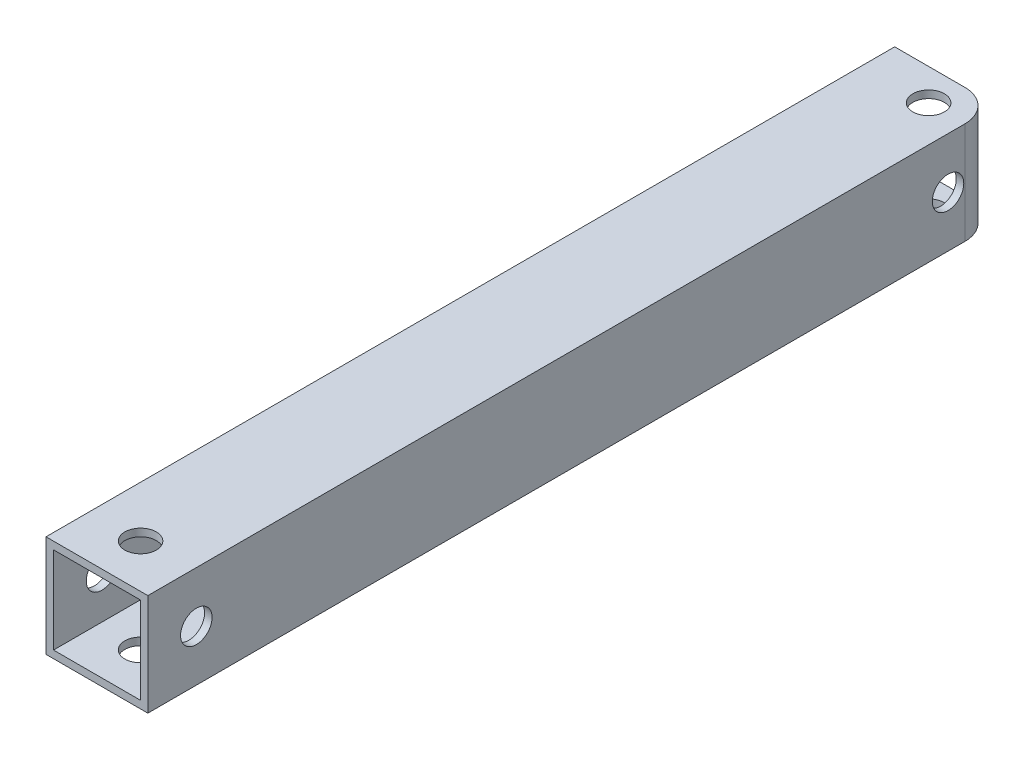
ISO-10303-21;
HEADER;
FILE_DESCRIPTION(('STEP AP214'),'2;1');
FILE_NAME('part.step','',(''),(''),'','','');
FILE_SCHEMA(('AUTOMOTIVE_DESIGN { 1 0 10303 214 1 1 1 1 }'));
ENDSEC;
DATA;
#1=APPLICATION_CONTEXT('core data for automotive mechanical design processes');
#2=APPLICATION_PROTOCOL_DEFINITION('international standard','automotive_design',2000,#1);
#3=PRODUCT_CONTEXT('',#1,'mechanical');
#4=PRODUCT('Part','Part','',(#3));
#5=PRODUCT_RELATED_PRODUCT_CATEGORY('part','',(#4));
#6=PRODUCT_DEFINITION_FORMATION('','',#4);
#7=PRODUCT_DEFINITION_CONTEXT('part definition',#1,'design');
#8=PRODUCT_DEFINITION('design','',#6,#7);
#9=PRODUCT_DEFINITION_SHAPE('','',#8);
#10=(LENGTH_UNIT() NAMED_UNIT(*) SI_UNIT(.MILLI.,.METRE.));
#11=(NAMED_UNIT(*) PLANE_ANGLE_UNIT() SI_UNIT($,.RADIAN.));
#12=(NAMED_UNIT(*) SI_UNIT($,.STERADIAN.) SOLID_ANGLE_UNIT());
#13=UNCERTAINTY_MEASURE_WITH_UNIT(LENGTH_MEASURE(1.E-05),#10,'distance_accuracy_value','');
#14=(GEOMETRIC_REPRESENTATION_CONTEXT(3) GLOBAL_UNCERTAINTY_ASSIGNED_CONTEXT((#13)) GLOBAL_UNIT_ASSIGNED_CONTEXT((#10,
#11,#12)) REPRESENTATION_CONTEXT('',''));
#15=CARTESIAN_POINT('',(0.,0.,0.));
#16=DIRECTION('',(0.,0.,1.));
#17=DIRECTION('',(1.,0.,0.));
#18=AXIS2_PLACEMENT_3D('',#15,#16,#17);
#19=CARTESIAN_POINT('',(0.,0.,175.));
#20=DIRECTION('',(0.,0.,1.));
#21=DIRECTION('',(1.,0.,0.));
#22=AXIS2_PLACEMENT_3D('',#19,#20,#21);
#23=PLANE('',#22);
#24=DIRECTION('',(0.,-1.,0.));
#25=VECTOR('',#24,1.);
#26=CARTESIAN_POINT('',(-21.,-21.,175.));
#27=LINE('',#26,#25);
#28=CARTESIAN_POINT('',(-21.,21.,175.));
#29=VERTEX_POINT('',#28);
#30=CARTESIAN_POINT('',(-21.,-21.,175.));
#31=VERTEX_POINT('',#30);
#32=EDGE_CURVE('E230',#29,#31,#27,.T.);
#33=ORIENTED_EDGE('',*,*,#32,.T.);
#34=DIRECTION('',(1.,0.,0.));
#35=VECTOR('',#34,1.);
#36=CARTESIAN_POINT('',(21.,-21.,175.));
#37=LINE('',#36,#35);
#38=CARTESIAN_POINT('',(21.,-21.,175.));
#39=VERTEX_POINT('',#38);
#40=EDGE_CURVE('E233',#31,#39,#37,.T.);
#41=ORIENTED_EDGE('',*,*,#40,.T.);
#42=DIRECTION('',(0.,1.,0.));
#43=VECTOR('',#42,1.);
#44=CARTESIAN_POINT('',(21.,-21.,175.));
#45=LINE('',#44,#43);
#46=CARTESIAN_POINT('',(21.,21.,175.));
#47=VERTEX_POINT('',#46);
#48=EDGE_CURVE('E198',#39,#47,#45,.T.);
#49=ORIENTED_EDGE('',*,*,#48,.T.);
#50=DIRECTION('',(-1.,0.,0.));
#51=VECTOR('',#50,1.);
#52=CARTESIAN_POINT('',(21.,21.,175.));
#53=LINE('',#52,#51);
#54=EDGE_CURVE('E237',#47,#29,#53,.T.);
#55=ORIENTED_EDGE('',*,*,#54,.T.);
#56=EDGE_LOOP('',(#33,#41,#49,#55));
#57=FACE_BOUND('',#56,.T.);
#58=DIRECTION('',(0.,-1.,0.));
#59=VECTOR('',#58,1.);
#60=CARTESIAN_POINT('',(-17.9,17.9,175.));
#61=LINE('',#60,#59);
#62=CARTESIAN_POINT('',(-17.9,17.9,175.));
#63=VERTEX_POINT('',#62);
#64=CARTESIAN_POINT('',(-17.9,-17.9,175.));
#65=VERTEX_POINT('',#64);
#66=EDGE_CURVE('E139',#63,#65,#61,.T.);
#67=ORIENTED_EDGE('',*,*,#66,.F.);
#68=DIRECTION('',(-1.,0.,0.));
#69=VECTOR('',#68,1.);
#70=CARTESIAN_POINT('',(17.9,17.9,175.));
#71=LINE('',#70,#69);
#72=CARTESIAN_POINT('',(17.9,17.9,175.));
#73=VERTEX_POINT('',#72);
#74=EDGE_CURVE('E288',#73,#63,#71,.T.);
#75=ORIENTED_EDGE('',*,*,#74,.F.);
#76=DIRECTION('',(0.,1.,0.));
#77=VECTOR('',#76,1.);
#78=CARTESIAN_POINT('',(17.9,-17.9,175.));
#79=LINE('',#78,#77);
#80=CARTESIAN_POINT('',(17.9,-17.9,175.));
#81=VERTEX_POINT('',#80);
#82=EDGE_CURVE('E149',#81,#73,#79,.T.);
#83=ORIENTED_EDGE('',*,*,#82,.F.);
#84=DIRECTION('',(1.,0.,0.));
#85=VECTOR('',#84,1.);
#86=CARTESIAN_POINT('',(-17.9,-17.9,175.));
#87=LINE('',#86,#85);
#88=EDGE_CURVE('E129',#65,#81,#87,.T.);
#89=ORIENTED_EDGE('',*,*,#88,.F.);
#90=EDGE_LOOP('',(#67,#75,#83,#89));
#91=FACE_BOUND('',#90,.T.);
#92=ADVANCED_FACE('F47',(#57,#91),#23,.T.);
#93=CARTESIAN_POINT('',(0.,0.,-175.));
#94=DIRECTION('',(0.,0.,1.));
#95=DIRECTION('',(1.,0.,0.));
#96=AXIS2_PLACEMENT_3D('',#93,#94,#95);
#97=PLANE('',#96);
#98=DIRECTION('',(-1.,0.,0.));
#99=VECTOR('',#98,1.);
#100=CARTESIAN_POINT('',(21.,21.,-175.));
#101=LINE('',#100,#99);
#102=CARTESIAN_POINT('',(8.,21.,-175.));
#103=VERTEX_POINT('',#102);
#104=CARTESIAN_POINT('',(-21.,21.,-175.));
#105=VERTEX_POINT('',#104);
#106=EDGE_CURVE('E224',#103,#105,#101,.T.);
#107=ORIENTED_EDGE('',*,*,#106,.F.);
#108=DIRECTION('',(0.,1.,0.));
#109=VECTOR('',#108,1.);
#110=CARTESIAN_POINT('',(8.,0.,-175.));
#111=LINE('',#110,#109);
#112=CARTESIAN_POINT('',(7.99999999999999,17.9,-175.));
#113=VERTEX_POINT('',#112);
#114=EDGE_CURVE('E169',#103,#113,#111,.F.);
#115=ORIENTED_EDGE('',*,*,#114,.T.);
#116=DIRECTION('',(-1.,0.,0.));
#117=VECTOR('',#116,1.);
#118=CARTESIAN_POINT('',(17.9,17.9,-175.));
#119=LINE('',#118,#117);
#120=CARTESIAN_POINT('',(-17.9,17.9,-175.));
#121=VERTEX_POINT('',#120);
#122=EDGE_CURVE('E160',#113,#121,#119,.T.);
#123=ORIENTED_EDGE('',*,*,#122,.T.);
#124=DIRECTION('',(0.,-1.,0.));
#125=VECTOR('',#124,1.);
#126=CARTESIAN_POINT('',(-17.9,17.9,-175.));
#127=LINE('',#126,#125);
#128=CARTESIAN_POINT('',(-17.9,-17.9,-175.));
#129=VERTEX_POINT('',#128);
#130=EDGE_CURVE('E146',#121,#129,#127,.T.);
#131=ORIENTED_EDGE('',*,*,#130,.T.);
#132=DIRECTION('',(1.,0.,0.));
#133=VECTOR('',#132,1.);
#134=CARTESIAN_POINT('',(-17.9,-17.9,-175.));
#135=LINE('',#134,#133);
#136=CARTESIAN_POINT('',(8.,-17.9,-175.));
#137=VERTEX_POINT('',#136);
#138=EDGE_CURVE('E132',#129,#137,#135,.T.);
#139=ORIENTED_EDGE('',*,*,#138,.T.);
#140=DIRECTION('',(0.,1.,0.));
#141=VECTOR('',#140,1.);
#142=CARTESIAN_POINT('',(8.,0.,-175.));
#143=LINE('',#142,#141);
#144=CARTESIAN_POINT('',(8.00000000000001,-21.,-175.));
#145=VERTEX_POINT('',#144);
#146=EDGE_CURVE('E167',#137,#145,#143,.F.);
#147=ORIENTED_EDGE('',*,*,#146,.T.);
#148=DIRECTION('',(1.,0.,0.));
#149=VECTOR('',#148,1.);
#150=CARTESIAN_POINT('',(21.,-21.,-175.));
#151=LINE('',#150,#149);
#152=CARTESIAN_POINT('',(-21.,-21.,-175.));
#153=VERTEX_POINT('',#152);
#154=EDGE_CURVE('E193',#153,#145,#151,.T.);
#155=ORIENTED_EDGE('',*,*,#154,.F.);
#156=DIRECTION('',(0.,-1.,0.));
#157=VECTOR('',#156,1.);
#158=CARTESIAN_POINT('',(-21.,-21.,-175.));
#159=LINE('',#158,#157);
#160=EDGE_CURVE('E145',#105,#153,#159,.T.);
#161=ORIENTED_EDGE('',*,*,#160,.F.);
#162=EDGE_LOOP('',(#107,#115,#123,#131,#139,#147,#155,#161));
#163=FACE_BOUND('',#162,.T.);
#164=ADVANCED_FACE('F179',(#163),#97,.F.);
#165=CARTESIAN_POINT('',(-21.,-21.,175.));
#166=DIRECTION('',(1.,0.,0.));
#167=DIRECTION('',(0.,1.,0.));
#168=AXIS2_PLACEMENT_3D('',#165,#166,#167);
#169=PLANE('',#168);
#170=CARTESIAN_POINT('',(-21.,0.,155.));
#171=DIRECTION('',(-1.,0.,0.));
#172=DIRECTION('',(0.,-1.,0.));
#173=AXIS2_PLACEMENT_3D('',#170,#171,#172);
#174=CIRCLE('',#173,6.50000000000002);
#175=CARTESIAN_POINT('',(-21.,-6.50000000000002,155.));
#176=VERTEX_POINT('',#175);
#177=EDGE_CURVE('E271',#176,#176,#174,.T.);
#178=ORIENTED_EDGE('',*,*,#177,.F.);
#179=EDGE_LOOP('',(#178));
#180=FACE_BOUND('',#179,.T.);
#181=CARTESIAN_POINT('',(-21.,0.,-155.));
#182=DIRECTION('',(1.,0.,0.));
#183=DIRECTION('',(0.,1.,0.));
#184=AXIS2_PLACEMENT_3D('',#181,#182,#183);
#185=CIRCLE('',#184,6.50000000000002);
#186=CARTESIAN_POINT('',(-21.,6.50000000000001,-155.));
#187=VERTEX_POINT('',#186);
#188=EDGE_CURVE('E274',#187,#187,#185,.T.);
#189=ORIENTED_EDGE('',*,*,#188,.T.);
#190=EDGE_LOOP('',(#189));
#191=FACE_BOUND('',#190,.T.);
#192=ORIENTED_EDGE('',*,*,#160,.T.);
#193=DIRECTION('',(0.,0.,-1.));
#194=VECTOR('',#193,1.);
#195=CARTESIAN_POINT('',(-21.,-21.,175.));
#196=LINE('',#195,#194);
#197=EDGE_CURVE('E199',#31,#153,#196,.T.);
#198=ORIENTED_EDGE('',*,*,#197,.F.);
#199=ORIENTED_EDGE('',*,*,#32,.F.);
#200=DIRECTION('',(0.,0.,-1.));
#201=VECTOR('',#200,1.);
#202=CARTESIAN_POINT('',(-21.,21.,175.));
#203=LINE('',#202,#201);
#204=EDGE_CURVE('E203',#29,#105,#203,.T.);
#205=ORIENTED_EDGE('',*,*,#204,.T.);
#206=EDGE_LOOP('',(#192,#198,#199,#205));
#207=FACE_BOUND('',#206,.T.);
#208=ADVANCED_FACE('F245',(#180,#191,#207),#169,.F.);
#209=CARTESIAN_POINT('',(21.,-21.,175.));
#210=DIRECTION('',(0.,1.,0.));
#211=DIRECTION('',(-1.,0.,0.));
#212=AXIS2_PLACEMENT_3D('',#209,#210,#211);
#213=PLANE('',#212);
#214=CARTESIAN_POINT('',(6.,-21.,-162.));
#215=DIRECTION('',(0.,1.,0.));
#216=DIRECTION('',(-1.,0.,0.));
#217=AXIS2_PLACEMENT_3D('',#214,#215,#216);
#218=CIRCLE('',#217,6.50000000000001);
#219=CARTESIAN_POINT('',(-0.500000000000006,-21.,-162.));
#220=VERTEX_POINT('',#219);
#221=EDGE_CURVE('E220',#220,#220,#218,.T.);
#222=ORIENTED_EDGE('',*,*,#221,.T.);
#223=EDGE_LOOP('',(#222));
#224=FACE_BOUND('',#223,.T.);
#225=CARTESIAN_POINT('',(0.,-21.,157.));
#226=DIRECTION('',(0.,-1.,0.));
#227=DIRECTION('',(1.,0.,0.));
#228=AXIS2_PLACEMENT_3D('',#225,#226,#227);
#229=CIRCLE('',#228,6.50000000000001);
#230=CARTESIAN_POINT('',(6.50000000000001,-21.,157.));
#231=VERTEX_POINT('',#230);
#232=EDGE_CURVE('E211',#231,#231,#229,.T.);
#233=ORIENTED_EDGE('',*,*,#232,.F.);
#234=EDGE_LOOP('',(#233));
#235=FACE_BOUND('',#234,.T.);
#236=ORIENTED_EDGE('',*,*,#154,.T.);
#237=CARTESIAN_POINT('',(8.,-21.,-162.));
#238=DIRECTION('',(0.,1.,0.));
#239=DIRECTION('',(-1.,0.,0.));
#240=AXIS2_PLACEMENT_3D('',#237,#238,#239);
#241=CIRCLE('',#240,13.);
#242=CARTESIAN_POINT('',(21.,-21.,-162.));
#243=VERTEX_POINT('',#242);
#244=EDGE_CURVE('E14',#145,#243,#241,.F.);
#245=ORIENTED_EDGE('',*,*,#244,.T.);
#246=DIRECTION('',(0.,0.,-1.));
#247=VECTOR('',#246,1.);
#248=CARTESIAN_POINT('',(21.,-21.,175.));
#249=LINE('',#248,#247);
#250=EDGE_CURVE('E190',#39,#243,#249,.T.);
#251=ORIENTED_EDGE('',*,*,#250,.F.);
#252=ORIENTED_EDGE('',*,*,#40,.F.);
#253=ORIENTED_EDGE('',*,*,#197,.T.);
#254=EDGE_LOOP('',(#236,#245,#251,#252,#253));
#255=FACE_BOUND('',#254,.T.);
#256=ADVANCED_FACE('F189',(#224,#235,#255),#213,.F.);
#257=CARTESIAN_POINT('',(21.,-21.,175.));
#258=DIRECTION('',(-1.,0.,0.));
#259=DIRECTION('',(0.,-1.,0.));
#260=AXIS2_PLACEMENT_3D('',#257,#258,#259);
#261=PLANE('',#260);
#262=CARTESIAN_POINT('',(21.,0.,155.));
#263=DIRECTION('',(-1.,0.,0.));
#264=DIRECTION('',(0.,-1.,0.));
#265=AXIS2_PLACEMENT_3D('',#262,#263,#264);
#266=CIRCLE('',#265,6.50000000000002);
#267=CARTESIAN_POINT('',(21.,-6.50000000000001,155.));
#268=VERTEX_POINT('',#267);
#269=EDGE_CURVE('E353',#268,#268,#266,.T.);
#270=ORIENTED_EDGE('',*,*,#269,.T.);
#271=EDGE_LOOP('',(#270));
#272=FACE_BOUND('',#271,.T.);
#273=CARTESIAN_POINT('',(21.,0.,-155.));
#274=DIRECTION('',(1.,0.,0.));
#275=DIRECTION('',(0.,1.,0.));
#276=AXIS2_PLACEMENT_3D('',#273,#274,#275);
#277=CIRCLE('',#276,6.50000000000002);
#278=CARTESIAN_POINT('',(21.,6.50000000000002,-155.));
#279=VERTEX_POINT('',#278);
#280=EDGE_CURVE('E216',#279,#279,#277,.T.);
#281=ORIENTED_EDGE('',*,*,#280,.F.);
#282=EDGE_LOOP('',(#281));
#283=FACE_BOUND('',#282,.T.);
#284=ORIENTED_EDGE('',*,*,#250,.T.);
#285=DIRECTION('',(0.,1.,0.));
#286=VECTOR('',#285,1.);
#287=CARTESIAN_POINT('',(21.,-21.,-162.));
#288=LINE('',#287,#286);
#289=CARTESIAN_POINT('',(21.,21.,-162.));
#290=VERTEX_POINT('',#289);
#291=EDGE_CURVE('E185',#243,#290,#288,.T.);
#292=ORIENTED_EDGE('',*,*,#291,.T.);
#293=DIRECTION('',(0.,0.,-1.));
#294=VECTOR('',#293,1.);
#295=CARTESIAN_POINT('',(21.,21.,175.));
#296=LINE('',#295,#294);
#297=EDGE_CURVE('E200',#47,#290,#296,.T.);
#298=ORIENTED_EDGE('',*,*,#297,.F.);
#299=ORIENTED_EDGE('',*,*,#48,.F.);
#300=EDGE_LOOP('',(#284,#292,#298,#299));
#301=FACE_BOUND('',#300,.T.);
#302=ADVANCED_FACE('F195',(#272,#283,#301),#261,.F.);
#303=CARTESIAN_POINT('',(21.,21.,175.));
#304=DIRECTION('',(0.,-1.,0.));
#305=DIRECTION('',(1.,0.,0.));
#306=AXIS2_PLACEMENT_3D('',#303,#304,#305);
#307=PLANE('',#306);
#308=CARTESIAN_POINT('',(6.,21.,-162.));
#309=DIRECTION('',(0.,1.,0.));
#310=DIRECTION('',(-1.,0.,0.));
#311=AXIS2_PLACEMENT_3D('',#308,#309,#310);
#312=CIRCLE('',#311,6.50000000000001);
#313=CARTESIAN_POINT('',(-0.500000000000009,21.,-162.));
#314=VERTEX_POINT('',#313);
#315=EDGE_CURVE('E356',#314,#314,#312,.T.);
#316=ORIENTED_EDGE('',*,*,#315,.F.);
#317=EDGE_LOOP('',(#316));
#318=FACE_BOUND('',#317,.T.);
#319=CARTESIAN_POINT('',(0.,21.,157.));
#320=DIRECTION('',(0.,-1.,0.));
#321=DIRECTION('',(1.,0.,0.));
#322=AXIS2_PLACEMENT_3D('',#319,#320,#321);
#323=CIRCLE('',#322,6.50000000000001);
#324=CARTESIAN_POINT('',(6.50000000000001,21.,157.));
#325=VERTEX_POINT('',#324);
#326=EDGE_CURVE('E164',#325,#325,#323,.T.);
#327=ORIENTED_EDGE('',*,*,#326,.T.);
#328=EDGE_LOOP('',(#327));
#329=FACE_BOUND('',#328,.T.);
#330=ORIENTED_EDGE('',*,*,#297,.T.);
#331=CARTESIAN_POINT('',(7.99999999999999,21.,-162.));
#332=DIRECTION('',(0.,-1.,0.));
#333=DIRECTION('',(1.,0.,0.));
#334=AXIS2_PLACEMENT_3D('',#331,#332,#333);
#335=CIRCLE('',#334,13.);
#336=EDGE_CURVE('E165',#290,#103,#335,.F.);
#337=ORIENTED_EDGE('',*,*,#336,.T.);
#338=ORIENTED_EDGE('',*,*,#106,.T.);
#339=ORIENTED_EDGE('',*,*,#204,.F.);
#340=ORIENTED_EDGE('',*,*,#54,.F.);
#341=EDGE_LOOP('',(#330,#337,#338,#339,#340));
#342=FACE_BOUND('',#341,.T.);
#343=ADVANCED_FACE('F222',(#318,#329,#342),#307,.F.);
#344=CARTESIAN_POINT('',(17.9,17.9,175.));
#345=DIRECTION('',(0.,-1.,0.));
#346=DIRECTION('',(1.,0.,0.));
#347=AXIS2_PLACEMENT_3D('',#344,#345,#346);
#348=PLANE('',#347);
#349=CARTESIAN_POINT('',(6.,17.9,-162.));
#350=DIRECTION('',(0.,-1.,0.));
#351=DIRECTION('',(1.,0.,0.));
#352=AXIS2_PLACEMENT_3D('',#349,#350,#351);
#353=CIRCLE('',#352,6.50000000000001);
#354=CARTESIAN_POINT('',(12.5,17.9,-162.));
#355=VERTEX_POINT('',#354);
#356=EDGE_CURVE('E219',#355,#355,#353,.T.);
#357=ORIENTED_EDGE('',*,*,#356,.F.);
#358=EDGE_LOOP('',(#357));
#359=FACE_BOUND('',#358,.T.);
#360=CARTESIAN_POINT('',(0.,17.9,157.));
#361=DIRECTION('',(0.,-1.,0.));
#362=DIRECTION('',(1.,0.,0.));
#363=AXIS2_PLACEMENT_3D('',#360,#361,#362);
#364=CIRCLE('',#363,6.50000000000001);
#365=CARTESIAN_POINT('',(6.50000000000001,17.9,157.));
#366=VERTEX_POINT('',#365);
#367=EDGE_CURVE('E210',#366,#366,#364,.T.);
#368=ORIENTED_EDGE('',*,*,#367,.F.);
#369=EDGE_LOOP('',(#368));
#370=FACE_BOUND('',#369,.T.);
#371=ORIENTED_EDGE('',*,*,#122,.F.);
#372=CARTESIAN_POINT('',(7.99999999999999,17.9,-162.));
#373=DIRECTION('',(0.,-1.,0.));
#374=DIRECTION('',(1.,0.,0.));
#375=AXIS2_PLACEMENT_3D('',#372,#373,#374);
#376=CIRCLE('',#375,13.);
#377=CARTESIAN_POINT('',(17.9,17.9,-170.425556361452));
#378=VERTEX_POINT('',#377);
#379=EDGE_CURVE('E71',#113,#378,#376,.T.);
#380=ORIENTED_EDGE('',*,*,#379,.T.);
#381=DIRECTION('',(0.,0.,-1.));
#382=VECTOR('',#381,1.);
#383=CARTESIAN_POINT('',(17.9,17.9,175.));
#384=LINE('',#383,#382);
#385=EDGE_CURVE('E163',#73,#378,#384,.T.);
#386=ORIENTED_EDGE('',*,*,#385,.F.);
#387=ORIENTED_EDGE('',*,*,#74,.T.);
#388=DIRECTION('',(0.,0.,-1.));
#389=VECTOR('',#388,1.);
#390=CARTESIAN_POINT('',(-17.9,17.9,175.));
#391=LINE('',#390,#389);
#392=EDGE_CURVE('E142',#63,#121,#391,.T.);
#393=ORIENTED_EDGE('',*,*,#392,.T.);
#394=EDGE_LOOP('',(#371,#380,#386,#387,#393));
#395=FACE_BOUND('',#394,.T.);
#396=ADVANCED_FACE('F257',(#359,#370,#395),#348,.T.);
#397=CARTESIAN_POINT('',(17.9,-17.9,175.));
#398=DIRECTION('',(-1.,0.,0.));
#399=DIRECTION('',(0.,-1.,0.));
#400=AXIS2_PLACEMENT_3D('',#397,#398,#399);
#401=PLANE('',#400);
#402=CARTESIAN_POINT('',(17.9,0.,155.));
#403=DIRECTION('',(-1.,0.,0.));
#404=DIRECTION('',(0.,-1.,0.));
#405=AXIS2_PLACEMENT_3D('',#402,#403,#404);
#406=CIRCLE('',#405,6.50000000000002);
#407=CARTESIAN_POINT('',(17.9,-6.50000000000001,155.));
#408=VERTEX_POINT('',#407);
#409=EDGE_CURVE('E349',#408,#408,#406,.T.);
#410=ORIENTED_EDGE('',*,*,#409,.F.);
#411=EDGE_LOOP('',(#410));
#412=FACE_BOUND('',#411,.T.);
#413=CARTESIAN_POINT('',(17.9,0.,-155.));
#414=DIRECTION('',(-1.,0.,0.));
#415=DIRECTION('',(0.,-1.,0.));
#416=AXIS2_PLACEMENT_3D('',#413,#414,#415);
#417=CIRCLE('',#416,6.50000000000002);
#418=CARTESIAN_POINT('',(17.9,-6.50000000000002,-155.));
#419=VERTEX_POINT('',#418);
#420=EDGE_CURVE('E215',#419,#419,#417,.T.);
#421=ORIENTED_EDGE('',*,*,#420,.F.);
#422=EDGE_LOOP('',(#421));
#423=FACE_BOUND('',#422,.T.);
#424=ORIENTED_EDGE('',*,*,#385,.T.);
#425=DIRECTION('',(0.,1.,0.));
#426=VECTOR('',#425,1.);
#427=CARTESIAN_POINT('',(17.9,17.9,-170.425556361452));
#428=LINE('',#427,#426);
#429=CARTESIAN_POINT('',(17.9,-17.9,-170.425556361452));
#430=VERTEX_POINT('',#429);
#431=EDGE_CURVE('E63',#378,#430,#428,.F.);
#432=ORIENTED_EDGE('',*,*,#431,.T.);
#433=DIRECTION('',(0.,0.,-1.));
#434=VECTOR('',#433,1.);
#435=CARTESIAN_POINT('',(17.9,-17.9,175.));
#436=LINE('',#435,#434);
#437=EDGE_CURVE('E174',#81,#430,#436,.T.);
#438=ORIENTED_EDGE('',*,*,#437,.F.);
#439=ORIENTED_EDGE('',*,*,#82,.T.);
#440=EDGE_LOOP('',(#424,#432,#438,#439));
#441=FACE_BOUND('',#440,.T.);
#442=ADVANCED_FACE('F307',(#412,#423,#441),#401,.T.);
#443=CARTESIAN_POINT('',(-17.9,-17.9,175.));
#444=DIRECTION('',(0.,1.,0.));
#445=DIRECTION('',(-1.,0.,0.));
#446=AXIS2_PLACEMENT_3D('',#443,#444,#445);
#447=PLANE('',#446);
#448=CARTESIAN_POINT('',(6.,-17.9,-162.));
#449=DIRECTION('',(0.,1.,0.));
#450=DIRECTION('',(-1.,0.,0.));
#451=AXIS2_PLACEMENT_3D('',#448,#449,#450);
#452=CIRCLE('',#451,6.50000000000001);
#453=CARTESIAN_POINT('',(-0.500000000000006,-17.9,-162.));
#454=VERTEX_POINT('',#453);
#455=EDGE_CURVE('E217',#454,#454,#452,.T.);
#456=ORIENTED_EDGE('',*,*,#455,.F.);
#457=EDGE_LOOP('',(#456));
#458=FACE_BOUND('',#457,.T.);
#459=CARTESIAN_POINT('',(0.,-17.9,157.));
#460=DIRECTION('',(0.,1.,0.));
#461=DIRECTION('',(-1.,0.,0.));
#462=AXIS2_PLACEMENT_3D('',#459,#460,#461);
#463=CIRCLE('',#462,6.50000000000001);
#464=CARTESIAN_POINT('',(6.50000000000001,-17.9,157.));
#465=VERTEX_POINT('',#464);
#466=EDGE_CURVE('E207',#465,#465,#463,.T.);
#467=ORIENTED_EDGE('',*,*,#466,.F.);
#468=EDGE_LOOP('',(#467));
#469=FACE_BOUND('',#468,.T.);
#470=ORIENTED_EDGE('',*,*,#437,.T.);
#471=CARTESIAN_POINT('',(8.,-17.9,-162.));
#472=DIRECTION('',(0.,1.,0.));
#473=DIRECTION('',(-1.,0.,0.));
#474=AXIS2_PLACEMENT_3D('',#471,#472,#473);
#475=CIRCLE('',#474,13.);
#476=EDGE_CURVE('E56',#430,#137,#475,.T.);
#477=ORIENTED_EDGE('',*,*,#476,.T.);
#478=ORIENTED_EDGE('',*,*,#138,.F.);
#479=DIRECTION('',(0.,0.,-1.));
#480=VECTOR('',#479,1.);
#481=CARTESIAN_POINT('',(-17.9,-17.9,175.));
#482=LINE('',#481,#480);
#483=EDGE_CURVE('E125',#65,#129,#482,.T.);
#484=ORIENTED_EDGE('',*,*,#483,.F.);
#485=ORIENTED_EDGE('',*,*,#88,.T.);
#486=EDGE_LOOP('',(#470,#477,#478,#484,#485));
#487=FACE_BOUND('',#486,.T.);
#488=ADVANCED_FACE('F127',(#458,#469,#487),#447,.T.);
#489=CARTESIAN_POINT('',(-17.9,17.9,175.));
#490=DIRECTION('',(1.,0.,0.));
#491=DIRECTION('',(0.,1.,0.));
#492=AXIS2_PLACEMENT_3D('',#489,#490,#491);
#493=PLANE('',#492);
#494=CARTESIAN_POINT('',(-17.9,0.,155.));
#495=DIRECTION('',(1.,0.,0.));
#496=DIRECTION('',(0.,1.,0.));
#497=AXIS2_PLACEMENT_3D('',#494,#495,#496);
#498=CIRCLE('',#497,6.50000000000002);
#499=CARTESIAN_POINT('',(-17.9,-6.50000000000002,155.));
#500=VERTEX_POINT('',#499);
#501=EDGE_CURVE('E51',#500,#500,#498,.T.);
#502=ORIENTED_EDGE('',*,*,#501,.F.);
#503=EDGE_LOOP('',(#502));
#504=FACE_BOUND('',#503,.T.);
#505=CARTESIAN_POINT('',(-17.9,0.,-155.));
#506=DIRECTION('',(1.,0.,0.));
#507=DIRECTION('',(0.,1.,0.));
#508=AXIS2_PLACEMENT_3D('',#505,#506,#507);
#509=CIRCLE('',#508,6.50000000000002);
#510=CARTESIAN_POINT('',(-17.9,6.50000000000001,-155.));
#511=VERTEX_POINT('',#510);
#512=EDGE_CURVE('E212',#511,#511,#509,.T.);
#513=ORIENTED_EDGE('',*,*,#512,.F.);
#514=EDGE_LOOP('',(#513));
#515=FACE_BOUND('',#514,.T.);
#516=ORIENTED_EDGE('',*,*,#130,.F.);
#517=ORIENTED_EDGE('',*,*,#392,.F.);
#518=ORIENTED_EDGE('',*,*,#66,.T.);
#519=ORIENTED_EDGE('',*,*,#483,.T.);
#520=EDGE_LOOP('',(#516,#517,#518,#519));
#521=FACE_BOUND('',#520,.T.);
#522=ADVANCED_FACE('F140',(#504,#515,#521),#493,.T.);
#523=CARTESIAN_POINT('',(0.,39.,157.));
#524=DIRECTION('',(0.,-1.,0.));
#525=DIRECTION('',(1.,0.,0.));
#526=AXIS2_PLACEMENT_3D('',#523,#524,#525);
#527=CYLINDRICAL_SURFACE('',#526,6.50000000000001);
#528=CARTESIAN_POINT('',(6.50000000000001,-17.9,157.));
#529=CARTESIAN_POINT('',(6.50000000000001,-17.9322916666667,157.));
#530=CARTESIAN_POINT('',(6.50000000000001,-17.9645833333333,157.));
#531=CARTESIAN_POINT('',(6.50000000000001,-18.0291666666667,157.));
#532=CARTESIAN_POINT('',(6.50000000000001,-18.0614583333333,157.));
#533=CARTESIAN_POINT('',(6.50000000000001,-18.1260416666667,157.));
#534=CARTESIAN_POINT('',(6.50000000000001,-18.1583333333333,157.));
#535=CARTESIAN_POINT('',(6.50000000000001,-18.2229166666667,157.));
#536=CARTESIAN_POINT('',(6.50000000000001,-18.2552083333333,157.));
#537=CARTESIAN_POINT('',(6.50000000000001,-18.3197916666667,157.));
#538=CARTESIAN_POINT('',(6.50000000000001,-18.3520833333333,157.));
#539=CARTESIAN_POINT('',(6.50000000000001,-18.4166666666667,157.));
#540=CARTESIAN_POINT('',(6.50000000000001,-18.4489583333333,157.));
#541=CARTESIAN_POINT('',(6.50000000000001,-18.5135416666667,157.));
#542=CARTESIAN_POINT('',(6.50000000000001,-18.5458333333333,157.));
#543=CARTESIAN_POINT('',(6.50000000000001,-18.6104166666667,157.));
#544=CARTESIAN_POINT('',(6.50000000000001,-18.6427083333333,157.));
#545=CARTESIAN_POINT('',(6.50000000000001,-18.7072916666667,157.));
#546=CARTESIAN_POINT('',(6.50000000000001,-18.7395833333333,157.));
#547=CARTESIAN_POINT('',(6.50000000000001,-18.8041666666667,157.));
#548=CARTESIAN_POINT('',(6.50000000000001,-18.8364583333333,157.));
#549=CARTESIAN_POINT('',(6.50000000000001,-18.9010416666667,157.));
#550=CARTESIAN_POINT('',(6.50000000000001,-18.9333333333333,157.));
#551=CARTESIAN_POINT('',(6.50000000000001,-18.9979166666667,157.));
#552=CARTESIAN_POINT('',(6.50000000000001,-19.0302083333333,157.));
#553=CARTESIAN_POINT('',(6.50000000000001,-19.0947916666667,157.));
#554=CARTESIAN_POINT('',(6.50000000000001,-19.1270833333333,157.));
#555=CARTESIAN_POINT('',(6.50000000000001,-19.1916666666667,157.));
#556=CARTESIAN_POINT('',(6.50000000000001,-19.2239583333333,157.));
#557=CARTESIAN_POINT('',(6.50000000000001,-19.2885416666667,157.));
#558=CARTESIAN_POINT('',(6.50000000000001,-19.3208333333333,157.));
#559=CARTESIAN_POINT('',(6.50000000000001,-19.3854166666667,157.));
#560=CARTESIAN_POINT('',(6.50000000000001,-19.4177083333333,157.));
#561=CARTESIAN_POINT('',(6.50000000000001,-19.4822916666667,157.));
#562=CARTESIAN_POINT('',(6.50000000000001,-19.5145833333333,157.));
#563=CARTESIAN_POINT('',(6.50000000000001,-19.5791666666667,157.));
#564=CARTESIAN_POINT('',(6.50000000000001,-19.6114583333333,157.));
#565=CARTESIAN_POINT('',(6.50000000000001,-19.6760416666667,157.));
#566=CARTESIAN_POINT('',(6.50000000000001,-19.7083333333333,157.));
#567=CARTESIAN_POINT('',(6.50000000000001,-19.7729166666667,157.));
#568=CARTESIAN_POINT('',(6.50000000000001,-19.8052083333333,157.));
#569=CARTESIAN_POINT('',(6.50000000000001,-19.8697916666667,157.));
#570=CARTESIAN_POINT('',(6.50000000000001,-19.9020833333333,157.));
#571=CARTESIAN_POINT('',(6.50000000000001,-19.9666666666667,157.));
#572=CARTESIAN_POINT('',(6.50000000000001,-19.9989583333333,157.));
#573=CARTESIAN_POINT('',(6.50000000000001,-20.0635416666667,157.));
#574=CARTESIAN_POINT('',(6.50000000000001,-20.0958333333333,157.));
#575=CARTESIAN_POINT('',(6.50000000000001,-20.1604166666667,157.));
#576=CARTESIAN_POINT('',(6.50000000000001,-20.1927083333333,157.));
#577=CARTESIAN_POINT('',(6.50000000000001,-20.2572916666667,157.));
#578=CARTESIAN_POINT('',(6.50000000000001,-20.2895833333333,157.));
#579=CARTESIAN_POINT('',(6.50000000000001,-20.3541666666667,157.));
#580=CARTESIAN_POINT('',(6.50000000000001,-20.3864583333333,157.));
#581=CARTESIAN_POINT('',(6.50000000000001,-20.4510416666667,157.));
#582=CARTESIAN_POINT('',(6.50000000000001,-20.4833333333333,157.));
#583=CARTESIAN_POINT('',(6.50000000000001,-20.5479166666667,157.));
#584=CARTESIAN_POINT('',(6.50000000000001,-20.5802083333333,157.));
#585=CARTESIAN_POINT('',(6.50000000000001,-20.6447916666667,157.));
#586=CARTESIAN_POINT('',(6.50000000000001,-20.6770833333333,157.));
#587=CARTESIAN_POINT('',(6.50000000000001,-20.7416666666667,157.));
#588=CARTESIAN_POINT('',(6.50000000000001,-20.7739583333333,157.));
#589=CARTESIAN_POINT('',(6.50000000000001,-20.8385416666667,157.));
#590=CARTESIAN_POINT('',(6.50000000000001,-20.8708333333333,157.));
#591=CARTESIAN_POINT('',(6.50000000000001,-20.9354166666667,157.));
#592=CARTESIAN_POINT('',(6.50000000000001,-20.9677083333333,157.));
#593=CARTESIAN_POINT('',(6.50000000000001,-21.,157.));
#594=B_SPLINE_CURVE_WITH_KNOTS('',3,(#528,#529,#530,#531,#532,#533,#534,#535,#536,#537,#538,
#539,#540,#541,#542,#543,#544,#545,#546,#547,#548,#549,#550,#551,#552,#553,#554,#555,#556,#557,
#558,#559,#560,#561,#562,#563,#564,#565,#566,#567,#568,#569,#570,#571,#572,#573,#574,#575,#576,
#577,#578,#579,#580,#581,#582,#583,#584,#585,#586,#587,#588,#589,#590,#591,#592,#593),
.UNSPECIFIED.,.F.,.F.,(4,2,2,2,2,2,2,2,2,2,2,2,2,2,2,2,2,2,2,2,2,2,2,2,2,2,2,2,2,2,2,2,4),(0.,
0.0968750000000032,0.193749999999999,0.290625000000003,0.387499999999999,0.484375000000002,
0.581249999999998,0.678125000000002,0.774999999999998,0.871875000000001,0.968750000000004,
1.065625,1.1625,1.259375,1.35625,1.453125,1.55,1.64687500000001,1.74375,1.84062500000001,1.9375,
2.03437500000001,2.13125,2.228125,2.32500000000001,2.421875,2.51875000000001,2.615625,
2.71250000000001,2.809375,2.90625000000001,3.003125,3.10000000000001),.UNSPECIFIED.);
#595=EDGE_CURVE('BSEAM318',#465,#231,#594,.T.);
#596=ORIENTED_EDGE('',*,*,#466,.T.);
#597=ORIENTED_EDGE('',*,*,#232,.T.);
#598=ORIENTED_EDGE('',*,*,#595,.T.);
#599=ORIENTED_EDGE('',*,*,#595,.F.);
#600=EDGE_LOOP('',(#596,#598,#597,#599));
#601=FACE_BOUND('',#600,.T.);
#602=ADVANCED_FACE('F318',(#601),#527,.F.);
#603=CARTESIAN_POINT('',(6.50000000000001,17.9,157.));
#604=CARTESIAN_POINT('',(6.50000000000001,17.9322916666667,157.));
#605=CARTESIAN_POINT('',(6.50000000000001,17.9645833333333,157.));
#606=CARTESIAN_POINT('',(6.50000000000001,18.0291666666667,157.));
#607=CARTESIAN_POINT('',(6.50000000000001,18.0614583333333,157.));
#608=CARTESIAN_POINT('',(6.50000000000001,18.1260416666667,157.));
#609=CARTESIAN_POINT('',(6.50000000000001,18.1583333333333,157.));
#610=CARTESIAN_POINT('',(6.50000000000001,18.2229166666667,157.));
#611=CARTESIAN_POINT('',(6.50000000000001,18.2552083333333,157.));
#612=CARTESIAN_POINT('',(6.50000000000001,18.3197916666667,157.));
#613=CARTESIAN_POINT('',(6.50000000000001,18.3520833333333,157.));
#614=CARTESIAN_POINT('',(6.50000000000001,18.4166666666667,157.));
#615=CARTESIAN_POINT('',(6.50000000000001,18.4489583333333,157.));
#616=CARTESIAN_POINT('',(6.50000000000001,18.5135416666667,157.));
#617=CARTESIAN_POINT('',(6.50000000000001,18.5458333333333,157.));
#618=CARTESIAN_POINT('',(6.50000000000001,18.6104166666667,157.));
#619=CARTESIAN_POINT('',(6.50000000000001,18.6427083333333,157.));
#620=CARTESIAN_POINT('',(6.50000000000001,18.7072916666667,157.));
#621=CARTESIAN_POINT('',(6.50000000000001,18.7395833333333,157.));
#622=CARTESIAN_POINT('',(6.50000000000001,18.8041666666667,157.));
#623=CARTESIAN_POINT('',(6.50000000000001,18.8364583333333,157.));
#624=CARTESIAN_POINT('',(6.50000000000001,18.9010416666667,157.));
#625=CARTESIAN_POINT('',(6.50000000000001,18.9333333333333,157.));
#626=CARTESIAN_POINT('',(6.50000000000001,18.9979166666667,157.));
#627=CARTESIAN_POINT('',(6.50000000000001,19.0302083333333,157.));
#628=CARTESIAN_POINT('',(6.50000000000001,19.0947916666667,157.));
#629=CARTESIAN_POINT('',(6.50000000000001,19.1270833333333,157.));
#630=CARTESIAN_POINT('',(6.50000000000001,19.1916666666667,157.));
#631=CARTESIAN_POINT('',(6.50000000000001,19.2239583333333,157.));
#632=CARTESIAN_POINT('',(6.50000000000001,19.2885416666667,157.));
#633=CARTESIAN_POINT('',(6.50000000000001,19.3208333333333,157.));
#634=CARTESIAN_POINT('',(6.50000000000001,19.3854166666667,157.));
#635=CARTESIAN_POINT('',(6.50000000000001,19.4177083333333,157.));
#636=CARTESIAN_POINT('',(6.50000000000001,19.4822916666667,157.));
#637=CARTESIAN_POINT('',(6.50000000000001,19.5145833333333,157.));
#638=CARTESIAN_POINT('',(6.50000000000001,19.5791666666667,157.));
#639=CARTESIAN_POINT('',(6.50000000000001,19.6114583333333,157.));
#640=CARTESIAN_POINT('',(6.50000000000001,19.6760416666667,157.));
#641=CARTESIAN_POINT('',(6.50000000000001,19.7083333333333,157.));
#642=CARTESIAN_POINT('',(6.50000000000001,19.7729166666667,157.));
#643=CARTESIAN_POINT('',(6.50000000000001,19.8052083333333,157.));
#644=CARTESIAN_POINT('',(6.50000000000001,19.8697916666667,157.));
#645=CARTESIAN_POINT('',(6.50000000000001,19.9020833333333,157.));
#646=CARTESIAN_POINT('',(6.50000000000001,19.9666666666667,157.));
#647=CARTESIAN_POINT('',(6.50000000000001,19.9989583333333,157.));
#648=CARTESIAN_POINT('',(6.50000000000001,20.0635416666667,157.));
#649=CARTESIAN_POINT('',(6.50000000000001,20.0958333333333,157.));
#650=CARTESIAN_POINT('',(6.50000000000001,20.1604166666667,157.));
#651=CARTESIAN_POINT('',(6.50000000000001,20.1927083333333,157.));
#652=CARTESIAN_POINT('',(6.50000000000001,20.2572916666667,157.));
#653=CARTESIAN_POINT('',(6.50000000000001,20.2895833333333,157.));
#654=CARTESIAN_POINT('',(6.50000000000001,20.3541666666667,157.));
#655=CARTESIAN_POINT('',(6.50000000000001,20.3864583333333,157.));
#656=CARTESIAN_POINT('',(6.50000000000001,20.4510416666667,157.));
#657=CARTESIAN_POINT('',(6.50000000000001,20.4833333333333,157.));
#658=CARTESIAN_POINT('',(6.50000000000001,20.5479166666667,157.));
#659=CARTESIAN_POINT('',(6.50000000000001,20.5802083333333,157.));
#660=CARTESIAN_POINT('',(6.50000000000001,20.6447916666667,157.));
#661=CARTESIAN_POINT('',(6.50000000000001,20.6770833333333,157.));
#662=CARTESIAN_POINT('',(6.50000000000001,20.7416666666667,157.));
#663=CARTESIAN_POINT('',(6.50000000000001,20.7739583333333,157.));
#664=CARTESIAN_POINT('',(6.50000000000001,20.8385416666667,157.));
#665=CARTESIAN_POINT('',(6.50000000000001,20.8708333333333,157.));
#666=CARTESIAN_POINT('',(6.50000000000001,20.9354166666667,157.));
#667=CARTESIAN_POINT('',(6.50000000000001,20.9677083333333,157.));
#668=CARTESIAN_POINT('',(6.50000000000001,21.,157.));
#669=B_SPLINE_CURVE_WITH_KNOTS('',3,(#603,#604,#605,#606,#607,#608,#609,#610,#611,#612,#613,
#614,#615,#616,#617,#618,#619,#620,#621,#622,#623,#624,#625,#626,#627,#628,#629,#630,#631,#632,
#633,#634,#635,#636,#637,#638,#639,#640,#641,#642,#643,#644,#645,#646,#647,#648,#649,#650,#651,
#652,#653,#654,#655,#656,#657,#658,#659,#660,#661,#662,#663,#664,#665,#666,#667,#668),
.UNSPECIFIED.,.F.,.F.,(4,2,2,2,2,2,2,2,2,2,2,2,2,2,2,2,2,2,2,2,2,2,2,2,2,2,2,2,2,2,2,2,4),(0.,
0.0968749999999997,0.193749999999999,0.290624999999999,0.387499999999999,0.484374999999999,
0.581249999999998,0.678124999999998,0.774999999999998,0.871875000000001,0.968750000000001,
1.065625,1.1625,1.259375,1.35625,1.453125,1.55,1.646875,1.74375,1.840625,1.9375,2.034375,
2.13125,2.228125,2.325,2.421875,2.51875,2.615625,2.7125,2.809375,2.90625,3.003125,3.1),.UNSPECIFIED.);
#670=EDGE_CURVE('BSEAM324',#366,#325,#669,.T.);
#671=ORIENTED_EDGE('',*,*,#367,.T.);
#672=ORIENTED_EDGE('',*,*,#326,.F.);
#673=ORIENTED_EDGE('',*,*,#670,.T.);
#674=ORIENTED_EDGE('',*,*,#670,.F.);
#675=EDGE_LOOP('',(#671,#673,#672,#674));
#676=FACE_BOUND('',#675,.T.);
#677=ADVANCED_FACE('F324',(#676),#527,.F.);
#678=CARTESIAN_POINT('',(-49.,0.,-155.));
#679=DIRECTION('',(1.,0.,0.));
#680=DIRECTION('',(0.,1.,0.));
#681=AXIS2_PLACEMENT_3D('',#678,#679,#680);
#682=CYLINDRICAL_SURFACE('',#681,6.50000000000002);
#683=ORIENTED_EDGE('',*,*,#512,.T.);
#684=EDGE_LOOP('',(#683));
#685=FACE_BOUND('',#684,.T.);
#686=ORIENTED_EDGE('',*,*,#188,.F.);
#687=EDGE_LOOP('',(#686));
#688=FACE_BOUND('',#687,.T.);
#689=ADVANCED_FACE('F326',(#685,#688),#682,.F.);
#690=ORIENTED_EDGE('',*,*,#420,.T.);
#691=EDGE_LOOP('',(#690));
#692=FACE_BOUND('',#691,.T.);
#693=ORIENTED_EDGE('',*,*,#280,.T.);
#694=EDGE_LOOP('',(#693));
#695=FACE_BOUND('',#694,.T.);
#696=ADVANCED_FACE('F329',(#692,#695),#682,.F.);
#697=CARTESIAN_POINT('',(6.,-21.,-162.));
#698=DIRECTION('',(0.,1.,0.));
#699=DIRECTION('',(-1.,0.,0.));
#700=AXIS2_PLACEMENT_3D('',#697,#698,#699);
#701=CYLINDRICAL_SURFACE('',#700,6.50000000000001);
#702=ORIENTED_EDGE('',*,*,#455,.T.);
#703=EDGE_LOOP('',(#702));
#704=FACE_BOUND('',#703,.T.);
#705=ORIENTED_EDGE('',*,*,#221,.F.);
#706=EDGE_LOOP('',(#705));
#707=FACE_BOUND('',#706,.T.);
#708=ADVANCED_FACE('F331',(#704,#707),#701,.F.);
#709=ORIENTED_EDGE('',*,*,#356,.T.);
#710=EDGE_LOOP('',(#709));
#711=FACE_BOUND('',#710,.T.);
#712=ORIENTED_EDGE('',*,*,#315,.T.);
#713=EDGE_LOOP('',(#712));
#714=FACE_BOUND('',#713,.T.);
#715=ADVANCED_FACE('F334',(#711,#714),#701,.F.);
#716=CARTESIAN_POINT('',(8.,-21.,-162.));
#717=DIRECTION('',(0.,1.,0.));
#718=DIRECTION('',(-1.,0.,0.));
#719=AXIS2_PLACEMENT_3D('',#716,#717,#718);
#720=CYLINDRICAL_SURFACE('',#719,13.);
#721=ORIENTED_EDGE('',*,*,#379,.F.);
#722=ORIENTED_EDGE('',*,*,#114,.F.);
#723=ORIENTED_EDGE('',*,*,#336,.F.);
#724=ORIENTED_EDGE('',*,*,#291,.F.);
#725=ORIENTED_EDGE('',*,*,#244,.F.);
#726=ORIENTED_EDGE('',*,*,#146,.F.);
#727=ORIENTED_EDGE('',*,*,#476,.F.);
#728=ORIENTED_EDGE('',*,*,#431,.F.);
#729=EDGE_LOOP('',(#721,#722,#723,#724,#725,#726,#727,#728));
#730=FACE_BOUND('',#729,.T.);
#731=ADVANCED_FACE('F49',(#730),#720,.T.);
#732=CARTESIAN_POINT('',(39.,0.,155.));
#733=DIRECTION('',(-1.,0.,0.));
#734=DIRECTION('',(0.,-1.,0.));
#735=AXIS2_PLACEMENT_3D('',#732,#733,#734);
#736=CYLINDRICAL_SURFACE('',#735,6.50000000000002);
#737=CARTESIAN_POINT('',(-17.9,-6.50000000000002,155.));
#738=CARTESIAN_POINT('',(-17.9322916666667,-6.50000000000002,155.));
#739=CARTESIAN_POINT('',(-17.9645833333333,-6.50000000000002,155.));
#740=CARTESIAN_POINT('',(-18.0291666666667,-6.50000000000002,155.));
#741=CARTESIAN_POINT('',(-18.0614583333333,-6.50000000000002,155.));
#742=CARTESIAN_POINT('',(-18.1260416666667,-6.50000000000002,155.));
#743=CARTESIAN_POINT('',(-18.1583333333333,-6.50000000000002,155.));
#744=CARTESIAN_POINT('',(-18.2229166666667,-6.50000000000002,155.));
#745=CARTESIAN_POINT('',(-18.2552083333333,-6.50000000000002,155.));
#746=CARTESIAN_POINT('',(-18.3197916666667,-6.50000000000002,155.));
#747=CARTESIAN_POINT('',(-18.3520833333333,-6.50000000000002,155.));
#748=CARTESIAN_POINT('',(-18.4166666666667,-6.50000000000002,155.));
#749=CARTESIAN_POINT('',(-18.4489583333333,-6.50000000000002,155.));
#750=CARTESIAN_POINT('',(-18.5135416666667,-6.50000000000002,155.));
#751=CARTESIAN_POINT('',(-18.5458333333333,-6.50000000000002,155.));
#752=CARTESIAN_POINT('',(-18.6104166666667,-6.50000000000002,155.));
#753=CARTESIAN_POINT('',(-18.6427083333333,-6.50000000000002,155.));
#754=CARTESIAN_POINT('',(-18.7072916666667,-6.50000000000002,155.));
#755=CARTESIAN_POINT('',(-18.7395833333333,-6.50000000000002,155.));
#756=CARTESIAN_POINT('',(-18.8041666666667,-6.50000000000002,155.));
#757=CARTESIAN_POINT('',(-18.8364583333333,-6.50000000000002,155.));
#758=CARTESIAN_POINT('',(-18.9010416666667,-6.50000000000002,155.));
#759=CARTESIAN_POINT('',(-18.9333333333333,-6.50000000000002,155.));
#760=CARTESIAN_POINT('',(-18.9979166666667,-6.50000000000002,155.));
#761=CARTESIAN_POINT('',(-19.0302083333333,-6.50000000000002,155.));
#762=CARTESIAN_POINT('',(-19.0947916666667,-6.50000000000002,155.));
#763=CARTESIAN_POINT('',(-19.1270833333333,-6.50000000000002,155.));
#764=CARTESIAN_POINT('',(-19.1916666666667,-6.50000000000002,155.));
#765=CARTESIAN_POINT('',(-19.2239583333333,-6.50000000000002,155.));
#766=CARTESIAN_POINT('',(-19.2885416666667,-6.50000000000002,155.));
#767=CARTESIAN_POINT('',(-19.3208333333333,-6.50000000000002,155.));
#768=CARTESIAN_POINT('',(-19.3854166666667,-6.50000000000002,155.));
#769=CARTESIAN_POINT('',(-19.4177083333333,-6.50000000000002,155.));
#770=CARTESIAN_POINT('',(-19.4822916666667,-6.50000000000002,155.));
#771=CARTESIAN_POINT('',(-19.5145833333333,-6.50000000000002,155.));
#772=CARTESIAN_POINT('',(-19.5791666666667,-6.50000000000002,155.));
#773=CARTESIAN_POINT('',(-19.6114583333333,-6.50000000000002,155.));
#774=CARTESIAN_POINT('',(-19.6760416666667,-6.50000000000002,155.));
#775=CARTESIAN_POINT('',(-19.7083333333333,-6.50000000000002,155.));
#776=CARTESIAN_POINT('',(-19.7729166666667,-6.50000000000002,155.));
#777=CARTESIAN_POINT('',(-19.8052083333333,-6.50000000000002,155.));
#778=CARTESIAN_POINT('',(-19.8697916666667,-6.50000000000002,155.));
#779=CARTESIAN_POINT('',(-19.9020833333333,-6.50000000000002,155.));
#780=CARTESIAN_POINT('',(-19.9666666666667,-6.50000000000002,155.));
#781=CARTESIAN_POINT('',(-19.9989583333333,-6.50000000000002,155.));
#782=CARTESIAN_POINT('',(-20.0635416666667,-6.50000000000002,155.));
#783=CARTESIAN_POINT('',(-20.0958333333333,-6.50000000000002,155.));
#784=CARTESIAN_POINT('',(-20.1604166666667,-6.50000000000002,155.));
#785=CARTESIAN_POINT('',(-20.1927083333333,-6.50000000000002,155.));
#786=CARTESIAN_POINT('',(-20.2572916666667,-6.50000000000002,155.));
#787=CARTESIAN_POINT('',(-20.2895833333333,-6.50000000000002,155.));
#788=CARTESIAN_POINT('',(-20.3541666666667,-6.50000000000002,155.));
#789=CARTESIAN_POINT('',(-20.3864583333333,-6.50000000000002,155.));
#790=CARTESIAN_POINT('',(-20.4510416666667,-6.50000000000002,155.));
#791=CARTESIAN_POINT('',(-20.4833333333333,-6.50000000000002,155.));
#792=CARTESIAN_POINT('',(-20.5479166666667,-6.50000000000002,155.));
#793=CARTESIAN_POINT('',(-20.5802083333333,-6.50000000000002,155.));
#794=CARTESIAN_POINT('',(-20.6447916666667,-6.50000000000002,155.));
#795=CARTESIAN_POINT('',(-20.6770833333333,-6.50000000000002,155.));
#796=CARTESIAN_POINT('',(-20.7416666666667,-6.50000000000002,155.));
#797=CARTESIAN_POINT('',(-20.7739583333333,-6.50000000000002,155.));
#798=CARTESIAN_POINT('',(-20.8385416666667,-6.50000000000002,155.));
#799=CARTESIAN_POINT('',(-20.8708333333333,-6.50000000000002,155.));
#800=CARTESIAN_POINT('',(-20.9354166666667,-6.50000000000002,155.));
#801=CARTESIAN_POINT('',(-20.9677083333333,-6.50000000000002,155.));
#802=CARTESIAN_POINT('',(-21.,-6.50000000000002,155.));
#803=B_SPLINE_CURVE_WITH_KNOTS('',3,(#737,#738,#739,#740,#741,#742,#743,#744,#745,#746,#747,
#748,#749,#750,#751,#752,#753,#754,#755,#756,#757,#758,#759,#760,#761,#762,#763,#764,#765,#766,
#767,#768,#769,#770,#771,#772,#773,#774,#775,#776,#777,#778,#779,#780,#781,#782,#783,#784,#785,
#786,#787,#788,#789,#790,#791,#792,#793,#794,#795,#796,#797,#798,#799,#800,#801,#802),
.UNSPECIFIED.,.F.,.F.,(4,2,2,2,2,2,2,2,2,2,2,2,2,2,2,2,2,2,2,2,2,2,2,2,2,2,2,2,2,2,2,2,4),(0.,
0.0968750000000032,0.193749999999999,0.290625000000003,0.387499999999999,0.484375000000002,
0.581249999999998,0.678125000000002,0.774999999999998,0.871875000000001,0.968750000000004,
1.065625,1.1625,1.259375,1.35625,1.453125,1.55,1.64687500000001,1.74375,1.84062500000001,1.9375,
2.03437500000001,2.13125,2.228125,2.32500000000001,2.421875,2.51875000000001,2.615625,
2.71250000000001,2.809375,2.90625000000001,3.003125,3.10000000000001),.UNSPECIFIED.);
#804=EDGE_CURVE('BSEAM336',#500,#176,#803,.T.);
#805=ORIENTED_EDGE('',*,*,#501,.T.);
#806=ORIENTED_EDGE('',*,*,#177,.T.);
#807=ORIENTED_EDGE('',*,*,#804,.T.);
#808=ORIENTED_EDGE('',*,*,#804,.F.);
#809=EDGE_LOOP('',(#805,#807,#806,#808));
#810=FACE_BOUND('',#809,.T.);
#811=ADVANCED_FACE('F336',(#810),#736,.F.);
#812=CARTESIAN_POINT('',(17.9,-6.50000000000001,155.));
#813=CARTESIAN_POINT('',(17.9322916666667,-6.50000000000001,155.));
#814=CARTESIAN_POINT('',(17.9645833333333,-6.50000000000001,155.));
#815=CARTESIAN_POINT('',(18.0291666666667,-6.50000000000001,155.));
#816=CARTESIAN_POINT('',(18.0614583333333,-6.50000000000001,155.));
#817=CARTESIAN_POINT('',(18.1260416666667,-6.50000000000001,155.));
#818=CARTESIAN_POINT('',(18.1583333333333,-6.50000000000001,155.));
#819=CARTESIAN_POINT('',(18.2229166666667,-6.50000000000001,155.));
#820=CARTESIAN_POINT('',(18.2552083333333,-6.50000000000001,155.));
#821=CARTESIAN_POINT('',(18.3197916666667,-6.50000000000001,155.));
#822=CARTESIAN_POINT('',(18.3520833333333,-6.50000000000001,155.));
#823=CARTESIAN_POINT('',(18.4166666666667,-6.50000000000001,155.));
#824=CARTESIAN_POINT('',(18.4489583333333,-6.50000000000001,155.));
#825=CARTESIAN_POINT('',(18.5135416666667,-6.50000000000001,155.));
#826=CARTESIAN_POINT('',(18.5458333333333,-6.50000000000001,155.));
#827=CARTESIAN_POINT('',(18.6104166666667,-6.50000000000001,155.));
#828=CARTESIAN_POINT('',(18.6427083333333,-6.50000000000001,155.));
#829=CARTESIAN_POINT('',(18.7072916666667,-6.50000000000001,155.));
#830=CARTESIAN_POINT('',(18.7395833333333,-6.50000000000001,155.));
#831=CARTESIAN_POINT('',(18.8041666666667,-6.50000000000001,155.));
#832=CARTESIAN_POINT('',(18.8364583333333,-6.50000000000001,155.));
#833=CARTESIAN_POINT('',(18.9010416666667,-6.50000000000001,155.));
#834=CARTESIAN_POINT('',(18.9333333333333,-6.50000000000001,155.));
#835=CARTESIAN_POINT('',(18.9979166666667,-6.50000000000001,155.));
#836=CARTESIAN_POINT('',(19.0302083333333,-6.50000000000001,155.));
#837=CARTESIAN_POINT('',(19.0947916666667,-6.50000000000001,155.));
#838=CARTESIAN_POINT('',(19.1270833333333,-6.50000000000001,155.));
#839=CARTESIAN_POINT('',(19.1916666666667,-6.50000000000001,155.));
#840=CARTESIAN_POINT('',(19.2239583333333,-6.50000000000001,155.));
#841=CARTESIAN_POINT('',(19.2885416666667,-6.50000000000001,155.));
#842=CARTESIAN_POINT('',(19.3208333333333,-6.50000000000001,155.));
#843=CARTESIAN_POINT('',(19.3854166666667,-6.50000000000001,155.));
#844=CARTESIAN_POINT('',(19.4177083333333,-6.50000000000001,155.));
#845=CARTESIAN_POINT('',(19.4822916666667,-6.50000000000001,155.));
#846=CARTESIAN_POINT('',(19.5145833333333,-6.50000000000001,155.));
#847=CARTESIAN_POINT('',(19.5791666666667,-6.50000000000001,155.));
#848=CARTESIAN_POINT('',(19.6114583333333,-6.50000000000001,155.));
#849=CARTESIAN_POINT('',(19.6760416666667,-6.50000000000001,155.));
#850=CARTESIAN_POINT('',(19.7083333333333,-6.50000000000001,155.));
#851=CARTESIAN_POINT('',(19.7729166666667,-6.50000000000001,155.));
#852=CARTESIAN_POINT('',(19.8052083333333,-6.50000000000001,155.));
#853=CARTESIAN_POINT('',(19.8697916666667,-6.50000000000001,155.));
#854=CARTESIAN_POINT('',(19.9020833333333,-6.50000000000001,155.));
#855=CARTESIAN_POINT('',(19.9666666666667,-6.50000000000001,155.));
#856=CARTESIAN_POINT('',(19.9989583333333,-6.50000000000001,155.));
#857=CARTESIAN_POINT('',(20.0635416666667,-6.50000000000001,155.));
#858=CARTESIAN_POINT('',(20.0958333333333,-6.50000000000001,155.));
#859=CARTESIAN_POINT('',(20.1604166666667,-6.50000000000001,155.));
#860=CARTESIAN_POINT('',(20.1927083333333,-6.50000000000001,155.));
#861=CARTESIAN_POINT('',(20.2572916666667,-6.50000000000001,155.));
#862=CARTESIAN_POINT('',(20.2895833333333,-6.50000000000001,155.));
#863=CARTESIAN_POINT('',(20.3541666666667,-6.50000000000001,155.));
#864=CARTESIAN_POINT('',(20.3864583333333,-6.50000000000001,155.));
#865=CARTESIAN_POINT('',(20.4510416666667,-6.50000000000001,155.));
#866=CARTESIAN_POINT('',(20.4833333333333,-6.50000000000001,155.));
#867=CARTESIAN_POINT('',(20.5479166666667,-6.50000000000001,155.));
#868=CARTESIAN_POINT('',(20.5802083333333,-6.50000000000001,155.));
#869=CARTESIAN_POINT('',(20.6447916666667,-6.50000000000001,155.));
#870=CARTESIAN_POINT('',(20.6770833333333,-6.50000000000001,155.));
#871=CARTESIAN_POINT('',(20.7416666666667,-6.50000000000001,155.));
#872=CARTESIAN_POINT('',(20.7739583333333,-6.50000000000001,155.));
#873=CARTESIAN_POINT('',(20.8385416666667,-6.50000000000001,155.));
#874=CARTESIAN_POINT('',(20.8708333333333,-6.50000000000001,155.));
#875=CARTESIAN_POINT('',(20.9354166666667,-6.50000000000001,155.));
#876=CARTESIAN_POINT('',(20.9677083333333,-6.50000000000001,155.));
#877=CARTESIAN_POINT('',(21.,-6.50000000000001,155.));
#878=B_SPLINE_CURVE_WITH_KNOTS('',3,(#812,#813,#814,#815,#816,#817,#818,#819,#820,#821,#822,
#823,#824,#825,#826,#827,#828,#829,#830,#831,#832,#833,#834,#835,#836,#837,#838,#839,#840,#841,
#842,#843,#844,#845,#846,#847,#848,#849,#850,#851,#852,#853,#854,#855,#856,#857,#858,#859,#860,
#861,#862,#863,#864,#865,#866,#867,#868,#869,#870,#871,#872,#873,#874,#875,#876,#877),
.UNSPECIFIED.,.F.,.F.,(4,2,2,2,2,2,2,2,2,2,2,2,2,2,2,2,2,2,2,2,2,2,2,2,2,2,2,2,2,2,2,2,4),(0.,
0.0968749999999997,0.193749999999999,0.290624999999999,0.387499999999999,0.484374999999999,
0.581249999999998,0.678124999999998,0.774999999999998,0.871875000000001,0.968750000000001,
1.065625,1.1625,1.259375,1.35625,1.453125,1.55,1.646875,1.74375,1.840625,1.9375,2.034375,
2.13125,2.228125,2.325,2.421875,2.51875,2.615625,2.7125,2.809375,2.90625,3.003125,3.1),.UNSPECIFIED.);
#879=EDGE_CURVE('BSEAM338',#408,#268,#878,.T.);
#880=ORIENTED_EDGE('',*,*,#409,.T.);
#881=ORIENTED_EDGE('',*,*,#269,.F.);
#882=ORIENTED_EDGE('',*,*,#879,.T.);
#883=ORIENTED_EDGE('',*,*,#879,.F.);
#884=EDGE_LOOP('',(#880,#882,#881,#883));
#885=FACE_BOUND('',#884,.T.);
#886=ADVANCED_FACE('F338',(#885),#736,.F.);
#887=CLOSED_SHELL('',(#92,#164,#208,#256,#302,#343,#396,#442,#488,#522,#602,#677,#689,#696,#708,
#715,#731,#811,#886));
#888=MANIFOLD_SOLID_BREP('B2',#887);
#889=ADVANCED_BREP_SHAPE_REPRESENTATION('',(#18,#888),#14);
#890=SHAPE_DEFINITION_REPRESENTATION(#9,#889);
ENDSEC;
END-ISO-10303-21;
